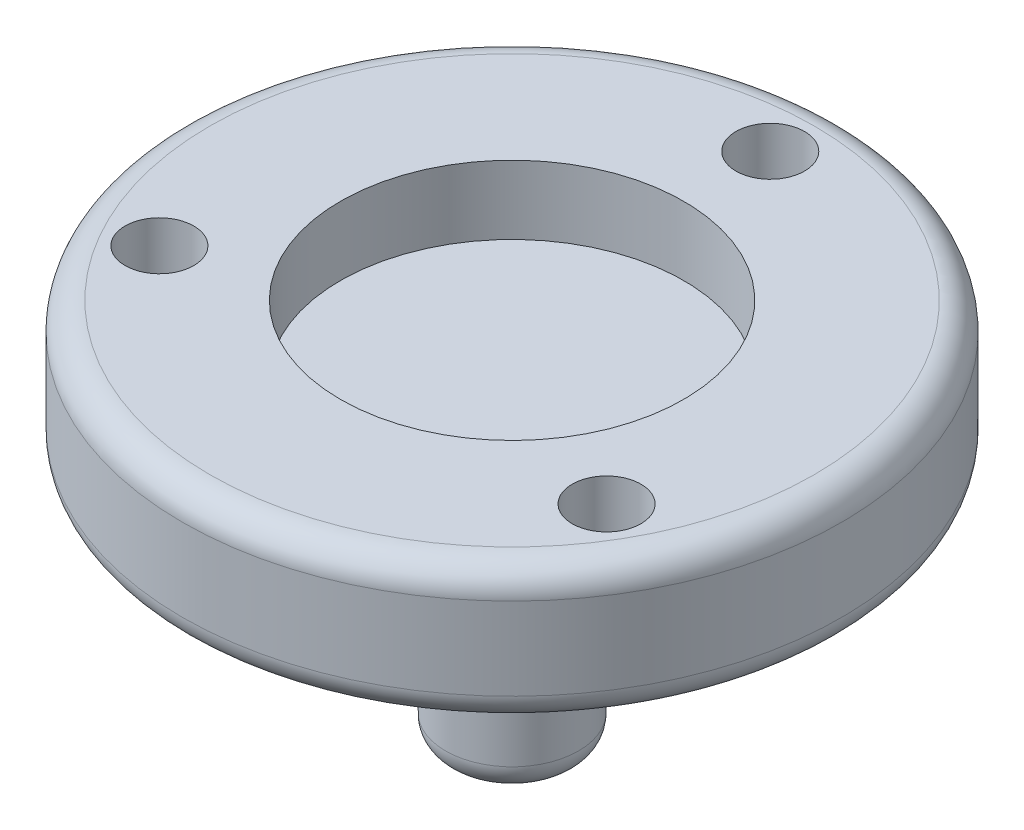
ISO-10303-21;
HEADER;
FILE_DESCRIPTION(('STEP AP214'),'2;1');
FILE_NAME('part.step','',(''),(''),'','','');
FILE_SCHEMA(('AUTOMOTIVE_DESIGN { 1 0 10303 214 1 1 1 1 }'));
ENDSEC;
DATA;
#1=APPLICATION_CONTEXT('core data for automotive mechanical design processes');
#2=APPLICATION_PROTOCOL_DEFINITION('international standard','automotive_design',2000,#1);
#3=PRODUCT_CONTEXT('',#1,'mechanical');
#4=PRODUCT('Part','Part','',(#3));
#5=PRODUCT_RELATED_PRODUCT_CATEGORY('part','',(#4));
#6=PRODUCT_DEFINITION_FORMATION('','',#4);
#7=PRODUCT_DEFINITION_CONTEXT('part definition',#1,'design');
#8=PRODUCT_DEFINITION('design','',#6,#7);
#9=PRODUCT_DEFINITION_SHAPE('','',#8);
#10=(LENGTH_UNIT() NAMED_UNIT(*) SI_UNIT(.MILLI.,.METRE.));
#11=(NAMED_UNIT(*) PLANE_ANGLE_UNIT() SI_UNIT($,.RADIAN.));
#12=(NAMED_UNIT(*) SI_UNIT($,.STERADIAN.) SOLID_ANGLE_UNIT());
#13=UNCERTAINTY_MEASURE_WITH_UNIT(LENGTH_MEASURE(1.E-05),#10,'distance_accuracy_value','');
#14=(GEOMETRIC_REPRESENTATION_CONTEXT(3) GLOBAL_UNCERTAINTY_ASSIGNED_CONTEXT((#13)) GLOBAL_UNIT_ASSIGNED_CONTEXT((#10,
#11,#12)) REPRESENTATION_CONTEXT('',''));
#15=CARTESIAN_POINT('',(0.,0.,0.));
#16=DIRECTION('',(0.,0.,1.));
#17=DIRECTION('',(1.,0.,0.));
#18=AXIS2_PLACEMENT_3D('',#15,#16,#17);
#19=CARTESIAN_POINT('',(0.,6.35,0.));
#20=DIRECTION('',(0.,-1.,0.));
#21=DIRECTION('',(0.,0.,-1.));
#22=AXIS2_PLACEMENT_3D('',#19,#20,#21);
#23=CYLINDRICAL_SURFACE('',#22,15.24);
#24=CARTESIAN_POINT('',(0.,1.27,0.));
#25=DIRECTION('',(0.,1.,0.));
#26=DIRECTION('',(0.,0.,1.));
#27=AXIS2_PLACEMENT_3D('',#24,#25,#26);
#28=CIRCLE('',#27,15.24);
#29=CARTESIAN_POINT('',(0.,1.27,15.24));
#30=VERTEX_POINT('',#29);
#31=EDGE_CURVE('E65',#30,#30,#28,.T.);
#32=ORIENTED_EDGE('',*,*,#31,.T.);
#33=EDGE_LOOP('',(#32));
#34=FACE_BOUND('',#33,.T.);
#35=CARTESIAN_POINT('',(0.,5.08,0.));
#36=DIRECTION('',(0.,1.,0.));
#37=DIRECTION('',(0.,0.,1.));
#38=AXIS2_PLACEMENT_3D('',#35,#36,#37);
#39=CIRCLE('',#38,15.24);
#40=CARTESIAN_POINT('',(0.,5.08,15.24));
#41=VERTEX_POINT('',#40);
#42=EDGE_CURVE('E69',#41,#41,#39,.F.);
#43=ORIENTED_EDGE('',*,*,#42,.T.);
#44=EDGE_LOOP('',(#43));
#45=FACE_BOUND('',#44,.T.);
#46=ADVANCED_FACE('F37',(#34,#45),#23,.T.);
#47=CARTESIAN_POINT('',(0.,6.35,0.));
#48=DIRECTION('',(0.,1.,0.));
#49=DIRECTION('',(0.,0.,1.));
#50=AXIS2_PLACEMENT_3D('',#47,#48,#49);
#51=PLANE('',#50);
#52=CARTESIAN_POINT('',(10.3386112703786,6.35,5.96900000000005));
#53=DIRECTION('',(0.,1.,0.));
#54=DIRECTION('',(-0.866025403784436,0.,-0.500000000000004));
#55=AXIS2_PLACEMENT_3D('',#52,#53,#54);
#56=CIRCLE('',#55,1.5875);
#57=CARTESIAN_POINT('',(8.96379594187081,6.35,5.17525000000004));
#58=VERTEX_POINT('',#57);
#59=EDGE_CURVE('E102',#58,#58,#56,.T.);
#60=ORIENTED_EDGE('',*,*,#59,.F.);
#61=EDGE_LOOP('',(#60));
#62=FACE_BOUND('',#61,.T.);
#63=CARTESIAN_POINT('',(-10.3386112703787,6.35,5.9689999999999));
#64=DIRECTION('',(0.,1.,0.));
#65=DIRECTION('',(0.866025403784443,0.,-0.499999999999992));
#66=AXIS2_PLACEMENT_3D('',#63,#64,#65);
#67=CIRCLE('',#66,1.5875);
#68=CARTESIAN_POINT('',(-8.96379594187088,6.35,5.17524999999992));
#69=VERTEX_POINT('',#68);
#70=EDGE_CURVE('E94',#69,#69,#67,.T.);
#71=ORIENTED_EDGE('',*,*,#70,.F.);
#72=EDGE_LOOP('',(#71));
#73=FACE_BOUND('',#72,.T.);
#74=CARTESIAN_POINT('',(0.,6.35,-11.938));
#75=DIRECTION('',(0.,1.,0.));
#76=DIRECTION('',(0.,0.,1.));
#77=AXIS2_PLACEMENT_3D('',#74,#75,#76);
#78=CIRCLE('',#77,1.5875);
#79=CARTESIAN_POINT('',(0.,6.35,-10.3505));
#80=VERTEX_POINT('',#79);
#81=EDGE_CURVE('E86',#80,#80,#78,.T.);
#82=ORIENTED_EDGE('',*,*,#81,.F.);
#83=EDGE_LOOP('',(#82));
#84=FACE_BOUND('',#83,.T.);
#85=CARTESIAN_POINT('',(0.,6.35,0.));
#86=DIRECTION('',(0.,1.,0.));
#87=DIRECTION('',(0.,0.,1.));
#88=AXIS2_PLACEMENT_3D('',#85,#86,#87);
#89=CIRCLE('',#88,13.97);
#90=CARTESIAN_POINT('',(0.,6.35,13.97));
#91=VERTEX_POINT('',#90);
#92=EDGE_CURVE('E73',#91,#91,#89,.T.);
#93=ORIENTED_EDGE('',*,*,#92,.T.);
#94=EDGE_LOOP('',(#93));
#95=FACE_BOUND('',#94,.T.);
#96=CARTESIAN_POINT('',(0.,6.35,0.));
#97=DIRECTION('',(0.,1.,0.));
#98=DIRECTION('',(0.,0.,1.));
#99=AXIS2_PLACEMENT_3D('',#96,#97,#98);
#100=CIRCLE('',#99,7.9375);
#101=CARTESIAN_POINT('',(0.,6.35,7.9375));
#102=VERTEX_POINT('',#101);
#103=EDGE_CURVE('E78',#102,#102,#100,.T.);
#104=ORIENTED_EDGE('',*,*,#103,.F.);
#105=EDGE_LOOP('',(#104));
#106=FACE_BOUND('',#105,.T.);
#107=ADVANCED_FACE('F119',(#62,#73,#84,#95,#106),#51,.T.);
#108=CARTESIAN_POINT('',(0.,0.,0.));
#109=DIRECTION('',(0.,1.,0.));
#110=DIRECTION('',(0.,0.,1.));
#111=AXIS2_PLACEMENT_3D('',#108,#109,#110);
#112=PLANE('',#111);
#113=CARTESIAN_POINT('',(0.,0.,0.));
#114=DIRECTION('',(0.,1.,0.));
#115=DIRECTION('',(0.,0.,1.));
#116=AXIS2_PLACEMENT_3D('',#113,#114,#115);
#117=CIRCLE('',#116,4.3434);
#118=CARTESIAN_POINT('',(0.,0.,4.3434));
#119=VERTEX_POINT('',#118);
#120=EDGE_CURVE('E10',#119,#119,#117,.T.);
#121=ORIENTED_EDGE('',*,*,#120,.T.);
#122=EDGE_LOOP('',(#121));
#123=FACE_BOUND('',#122,.T.);
#124=CARTESIAN_POINT('',(0.,0.,0.));
#125=DIRECTION('',(0.,1.,0.));
#126=DIRECTION('',(0.,0.,1.));
#127=AXIS2_PLACEMENT_3D('',#124,#125,#126);
#128=CIRCLE('',#127,13.97);
#129=CARTESIAN_POINT('',(0.,0.,13.97));
#130=VERTEX_POINT('',#129);
#131=EDGE_CURVE('E61',#130,#130,#128,.F.);
#132=ORIENTED_EDGE('',*,*,#131,.T.);
#133=EDGE_LOOP('',(#132));
#134=FACE_BOUND('',#133,.T.);
#135=ADVANCED_FACE('F122',(#123,#134),#112,.F.);
#136=CARTESIAN_POINT('',(0.,3.175,0.));
#137=DIRECTION('',(0.,1.,0.));
#138=DIRECTION('',(0.,0.,1.));
#139=AXIS2_PLACEMENT_3D('',#136,#137,#138);
#140=CYLINDRICAL_SURFACE('',#139,7.9375);
#141=CARTESIAN_POINT('',(0.,3.175,0.));
#142=DIRECTION('',(0.,1.,0.));
#143=DIRECTION('',(0.,0.,1.));
#144=AXIS2_PLACEMENT_3D('',#141,#142,#143);
#145=CIRCLE('',#144,7.9375);
#146=CARTESIAN_POINT('',(0.,3.175,7.9375));
#147=VERTEX_POINT('',#146);
#148=EDGE_CURVE('E77',#147,#147,#145,.T.);
#149=ORIENTED_EDGE('',*,*,#148,.F.);
#150=EDGE_LOOP('',(#149));
#151=FACE_BOUND('',#150,.T.);
#152=ORIENTED_EDGE('',*,*,#103,.T.);
#153=EDGE_LOOP('',(#152));
#154=FACE_BOUND('',#153,.T.);
#155=ADVANCED_FACE('F132',(#151,#154),#140,.F.);
#156=CARTESIAN_POINT('',(0.,3.175,0.));
#157=DIRECTION('',(0.,1.,0.));
#158=DIRECTION('',(0.,0.,1.));
#159=AXIS2_PLACEMENT_3D('',#156,#157,#158);
#160=PLANE('',#159);
#161=ORIENTED_EDGE('',*,*,#148,.T.);
#162=EDGE_LOOP('',(#161));
#163=FACE_BOUND('',#162,.T.);
#164=ADVANCED_FACE('F134',(#163),#160,.T.);
#165=CARTESIAN_POINT('',(0.,5.08,0.));
#166=DIRECTION('',(0.,1.,0.));
#167=DIRECTION('',(0.,0.,1.));
#168=AXIS2_PLACEMENT_3D('',#165,#166,#167);
#169=TOROIDAL_SURFACE('',#168,13.97,1.27);
#170=ORIENTED_EDGE('',*,*,#42,.F.);
#171=EDGE_LOOP('',(#170));
#172=FACE_BOUND('',#171,.T.);
#173=ORIENTED_EDGE('',*,*,#92,.F.);
#174=EDGE_LOOP('',(#173));
#175=FACE_BOUND('',#174,.T.);
#176=ADVANCED_FACE('F141',(#172,#175),#169,.T.);
#177=CARTESIAN_POINT('',(0.,3.81,-11.938));
#178=DIRECTION('',(0.,1.,0.));
#179=DIRECTION('',(0.,0.,1.));
#180=AXIS2_PLACEMENT_3D('',#177,#178,#179);
#181=CYLINDRICAL_SURFACE('',#180,1.5875);
#182=CARTESIAN_POINT('',(0.,3.81,-11.938));
#183=DIRECTION('',(0.,1.,0.));
#184=DIRECTION('',(0.,0.,1.));
#185=AXIS2_PLACEMENT_3D('',#182,#183,#184);
#186=CIRCLE('',#185,1.5875);
#187=CARTESIAN_POINT('',(0.,3.81,-10.3505));
#188=VERTEX_POINT('',#187);
#189=EDGE_CURVE('E82',#188,#188,#186,.T.);
#190=ORIENTED_EDGE('',*,*,#189,.F.);
#191=EDGE_LOOP('',(#190));
#192=FACE_BOUND('',#191,.T.);
#193=ORIENTED_EDGE('',*,*,#81,.T.);
#194=EDGE_LOOP('',(#193));
#195=FACE_BOUND('',#194,.T.);
#196=ADVANCED_FACE('F155',(#192,#195),#181,.F.);
#197=CARTESIAN_POINT('',(0.,3.81,-11.938));
#198=DIRECTION('',(0.,1.,0.));
#199=DIRECTION('',(0.,0.,1.));
#200=AXIS2_PLACEMENT_3D('',#197,#198,#199);
#201=PLANE('',#200);
#202=ORIENTED_EDGE('',*,*,#189,.T.);
#203=EDGE_LOOP('',(#202));
#204=FACE_BOUND('',#203,.T.);
#205=ADVANCED_FACE('F187',(#204),#201,.T.);
#206=CARTESIAN_POINT('',(-10.3386112703787,3.81,5.9689999999999));
#207=DIRECTION('',(0.,1.,0.));
#208=DIRECTION('',(0.,0.,1.));
#209=AXIS2_PLACEMENT_3D('',#206,#207,#208);
#210=CYLINDRICAL_SURFACE('',#209,1.5875);
#211=CARTESIAN_POINT('',(-10.3386112703787,3.81,5.9689999999999));
#212=DIRECTION('',(0.,1.,0.));
#213=DIRECTION('',(0.866025403784443,0.,-0.499999999999992));
#214=AXIS2_PLACEMENT_3D('',#211,#212,#213);
#215=CIRCLE('',#214,1.5875);
#216=CARTESIAN_POINT('',(-8.96379594187088,3.81,5.17524999999992));
#217=VERTEX_POINT('',#216);
#218=EDGE_CURVE('E98',#217,#217,#215,.T.);
#219=ORIENTED_EDGE('',*,*,#218,.F.);
#220=EDGE_LOOP('',(#219));
#221=FACE_BOUND('',#220,.T.);
#222=ORIENTED_EDGE('',*,*,#70,.T.);
#223=EDGE_LOOP('',(#222));
#224=FACE_BOUND('',#223,.T.);
#225=ADVANCED_FACE('F183',(#221,#224),#210,.F.);
#226=CARTESIAN_POINT('',(-10.3386112703787,3.81,5.9689999999999));
#227=DIRECTION('',(0.,1.,0.));
#228=DIRECTION('',(0.866025403784443,0.,-0.499999999999992));
#229=AXIS2_PLACEMENT_3D('',#226,#227,#228);
#230=PLANE('',#229);
#231=ORIENTED_EDGE('',*,*,#218,.T.);
#232=EDGE_LOOP('',(#231));
#233=FACE_BOUND('',#232,.T.);
#234=ADVANCED_FACE('F115',(#233),#230,.T.);
#235=CARTESIAN_POINT('',(10.3386112703786,3.81,5.96900000000005));
#236=DIRECTION('',(0.,1.,0.));
#237=DIRECTION('',(0.,0.,1.));
#238=AXIS2_PLACEMENT_3D('',#235,#236,#237);
#239=CYLINDRICAL_SURFACE('',#238,1.5875);
#240=CARTESIAN_POINT('',(10.3386112703786,3.81,5.96900000000005));
#241=DIRECTION('',(0.,1.,0.));
#242=DIRECTION('',(-0.866025403784436,0.,-0.500000000000004));
#243=AXIS2_PLACEMENT_3D('',#240,#241,#242);
#244=CIRCLE('',#243,1.5875);
#245=CARTESIAN_POINT('',(8.96379594187081,3.81,5.17525000000004));
#246=VERTEX_POINT('',#245);
#247=EDGE_CURVE('E90',#246,#246,#244,.T.);
#248=ORIENTED_EDGE('',*,*,#247,.F.);
#249=EDGE_LOOP('',(#248));
#250=FACE_BOUND('',#249,.T.);
#251=ORIENTED_EDGE('',*,*,#59,.T.);
#252=EDGE_LOOP('',(#251));
#253=FACE_BOUND('',#252,.T.);
#254=ADVANCED_FACE('F112',(#250,#253),#239,.F.);
#255=CARTESIAN_POINT('',(10.3386112703786,3.81,5.96900000000005));
#256=DIRECTION('',(0.,1.,0.));
#257=DIRECTION('',(-0.866025403784436,0.,-0.500000000000004));
#258=AXIS2_PLACEMENT_3D('',#255,#256,#257);
#259=PLANE('',#258);
#260=ORIENTED_EDGE('',*,*,#247,.T.);
#261=EDGE_LOOP('',(#260));
#262=FACE_BOUND('',#261,.T.);
#263=ADVANCED_FACE('F110',(#262),#259,.T.);
#264=CARTESIAN_POINT('',(0.,1.27,0.));
#265=DIRECTION('',(0.,1.,0.));
#266=DIRECTION('',(0.,0.,1.));
#267=AXIS2_PLACEMENT_3D('',#264,#265,#266);
#268=TOROIDAL_SURFACE('',#267,13.97,1.27);
#269=ORIENTED_EDGE('',*,*,#131,.F.);
#270=EDGE_LOOP('',(#269));
#271=FACE_BOUND('',#270,.T.);
#272=ORIENTED_EDGE('',*,*,#31,.F.);
#273=EDGE_LOOP('',(#272));
#274=FACE_BOUND('',#273,.T.);
#275=ADVANCED_FACE('F157',(#271,#274),#268,.T.);
#276=CARTESIAN_POINT('',(0.,-11.43,0.));
#277=DIRECTION('',(0.,1.,0.));
#278=DIRECTION('',(0.,0.,1.));
#279=AXIS2_PLACEMENT_3D('',#276,#277,#278);
#280=CYLINDRICAL_SURFACE('',#279,3.0734);
#281=CARTESIAN_POINT('',(0.,-10.16,0.));
#282=DIRECTION('',(0.,-1.,0.));
#283=DIRECTION('',(0.,0.,-1.));
#284=AXIS2_PLACEMENT_3D('',#281,#282,#283);
#285=CIRCLE('',#284,3.0734);
#286=CARTESIAN_POINT('',(0.,-10.16,-3.0734));
#287=VERTEX_POINT('',#286);
#288=EDGE_CURVE('E45',#287,#287,#285,.F.);
#289=ORIENTED_EDGE('',*,*,#288,.T.);
#290=EDGE_LOOP('',(#289));
#291=FACE_BOUND('',#290,.T.);
#292=CARTESIAN_POINT('',(0.,-1.27,0.));
#293=DIRECTION('',(0.,1.,0.));
#294=DIRECTION('',(0.,0.,1.));
#295=AXIS2_PLACEMENT_3D('',#292,#293,#294);
#296=CIRCLE('',#295,3.0734);
#297=CARTESIAN_POINT('',(0.,-1.27,3.0734));
#298=VERTEX_POINT('',#297);
#299=EDGE_CURVE('E50',#298,#298,#296,.F.);
#300=ORIENTED_EDGE('',*,*,#299,.T.);
#301=EDGE_LOOP('',(#300));
#302=FACE_BOUND('',#301,.T.);
#303=ADVANCED_FACE('F159',(#291,#302),#280,.T.);
#304=CARTESIAN_POINT('',(0.,-11.43,0.));
#305=DIRECTION('',(0.,-1.,0.));
#306=DIRECTION('',(0.,0.,-1.));
#307=AXIS2_PLACEMENT_3D('',#304,#305,#306);
#308=PLANE('',#307);
#309=CARTESIAN_POINT('',(0.,-11.43,0.));
#310=DIRECTION('',(0.,-1.,0.));
#311=DIRECTION('',(0.,0.,-1.));
#312=AXIS2_PLACEMENT_3D('',#309,#310,#311);
#313=CIRCLE('',#312,1.8034);
#314=CARTESIAN_POINT('',(0.,-11.43,-1.8034));
#315=VERTEX_POINT('',#314);
#316=EDGE_CURVE('E55',#315,#315,#313,.T.);
#317=ORIENTED_EDGE('',*,*,#316,.T.);
#318=EDGE_LOOP('',(#317));
#319=FACE_BOUND('',#318,.T.);
#320=ADVANCED_FACE('F163',(#319),#308,.T.);
#321=CARTESIAN_POINT('',(0.,-10.16,0.));
#322=DIRECTION('',(0.,-1.,0.));
#323=DIRECTION('',(0.,0.,-1.));
#324=AXIS2_PLACEMENT_3D('',#321,#322,#323);
#325=TOROIDAL_SURFACE('',#324,1.8034,1.27);
#326=ORIENTED_EDGE('',*,*,#288,.F.);
#327=EDGE_LOOP('',(#326));
#328=FACE_BOUND('',#327,.T.);
#329=ORIENTED_EDGE('',*,*,#316,.F.);
#330=EDGE_LOOP('',(#329));
#331=FACE_BOUND('',#330,.T.);
#332=ADVANCED_FACE('F161',(#328,#331),#325,.T.);
#333=CARTESIAN_POINT('',(0.,-1.27,0.));
#334=DIRECTION('',(0.,1.,0.));
#335=DIRECTION('',(0.,0.,1.));
#336=AXIS2_PLACEMENT_3D('',#333,#334,#335);
#337=TOROIDAL_SURFACE('',#336,4.3434,1.27);
#338=ORIENTED_EDGE('',*,*,#120,.F.);
#339=EDGE_LOOP('',(#338));
#340=FACE_BOUND('',#339,.T.);
#341=ORIENTED_EDGE('',*,*,#299,.F.);
#342=EDGE_LOOP('',(#341));
#343=FACE_BOUND('',#342,.T.);
#344=ADVANCED_FACE('F39',(#340,#343),#337,.F.);
#345=CLOSED_SHELL('',(#46,#107,#135,#155,#164,#176,#196,#205,#225,#234,#254,#263,#275,#303,#320,
#332,#344));
#346=MANIFOLD_SOLID_BREP('B2',#345);
#347=ADVANCED_BREP_SHAPE_REPRESENTATION('',(#18,#346),#14);
#348=SHAPE_DEFINITION_REPRESENTATION(#9,#347);
ENDSEC;
END-ISO-10303-21;
